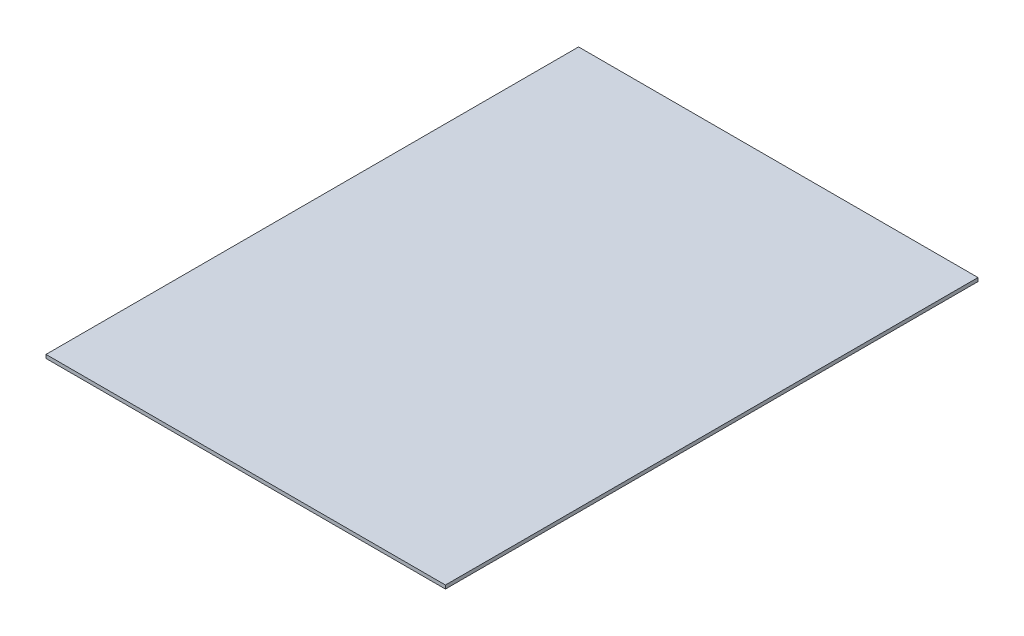
ISO-10303-21;
HEADER;
FILE_DESCRIPTION(('STEP AP214'),'2;1');
FILE_NAME('part.step','',(''),(''),'','','');
FILE_SCHEMA(('AUTOMOTIVE_DESIGN { 1 0 10303 214 1 1 1 1 }'));
ENDSEC;
DATA;
#1=APPLICATION_CONTEXT('core data for automotive mechanical design processes');
#2=APPLICATION_PROTOCOL_DEFINITION('international standard','automotive_design',2000,#1);
#3=PRODUCT_CONTEXT('',#1,'mechanical');
#4=PRODUCT('Part','Part','',(#3));
#5=PRODUCT_RELATED_PRODUCT_CATEGORY('part','',(#4));
#6=PRODUCT_DEFINITION_FORMATION('','',#4);
#7=PRODUCT_DEFINITION_CONTEXT('part definition',#1,'design');
#8=PRODUCT_DEFINITION('design','',#6,#7);
#9=PRODUCT_DEFINITION_SHAPE('','',#8);
#10=(LENGTH_UNIT() NAMED_UNIT(*) SI_UNIT(.MILLI.,.METRE.));
#11=(NAMED_UNIT(*) PLANE_ANGLE_UNIT() SI_UNIT($,.RADIAN.));
#12=(NAMED_UNIT(*) SI_UNIT($,.STERADIAN.) SOLID_ANGLE_UNIT());
#13=UNCERTAINTY_MEASURE_WITH_UNIT(LENGTH_MEASURE(1.E-05),#10,'distance_accuracy_value','');
#14=(GEOMETRIC_REPRESENTATION_CONTEXT(3) GLOBAL_UNCERTAINTY_ASSIGNED_CONTEXT((#13)) GLOBAL_UNIT_ASSIGNED_CONTEXT((#10,
#11,#12)) REPRESENTATION_CONTEXT('',''));
#15=CARTESIAN_POINT('',(0.,0.,0.));
#16=DIRECTION('',(0.,0.,1.));
#17=DIRECTION('',(1.,0.,0.));
#18=AXIS2_PLACEMENT_3D('',#15,#16,#17);
#19=CARTESIAN_POINT('',(-304.8,0.762,304.8));
#20=DIRECTION('',(0.,-1.,0.));
#21=DIRECTION('',(0.,0.,-1.));
#22=AXIS2_PLACEMENT_3D('',#19,#20,#21);
#23=PLANE('',#22);
#24=DIRECTION('',(-1.,0.,0.));
#25=VECTOR('',#24,1.);
#26=CARTESIAN_POINT('',(-304.8,0.762,76.2));
#27=LINE('',#26,#25);
#28=CARTESIAN_POINT('',(-133.35,0.762,76.2));
#29=VERTEX_POINT('',#28);
#30=CARTESIAN_POINT('',(-304.8,0.762,76.2));
#31=VERTEX_POINT('',#30);
#32=EDGE_CURVE('E94',#29,#31,#27,.T.);
#33=ORIENTED_EDGE('',*,*,#32,.T.);
#34=DIRECTION('',(0.,0.,-1.));
#35=VECTOR('',#34,1.);
#36=CARTESIAN_POINT('',(-304.8,0.762,304.8));
#37=LINE('',#36,#35);
#38=CARTESIAN_POINT('',(-304.8,0.762,304.8));
#39=VERTEX_POINT('',#38);
#40=EDGE_CURVE('E12',#39,#31,#37,.T.);
#41=ORIENTED_EDGE('',*,*,#40,.F.);
#42=DIRECTION('',(-1.,0.,0.));
#43=VECTOR('',#42,1.);
#44=CARTESIAN_POINT('',(-304.8,0.762,304.8));
#45=LINE('',#44,#43);
#46=CARTESIAN_POINT('',(-133.35,0.762,304.8));
#47=VERTEX_POINT('',#46);
#48=EDGE_CURVE('E118',#47,#39,#45,.T.);
#49=ORIENTED_EDGE('',*,*,#48,.F.);
#50=DIRECTION('',(0.,0.,-1.));
#51=VECTOR('',#50,1.);
#52=CARTESIAN_POINT('',(-133.35,0.762,304.8));
#53=LINE('',#52,#51);
#54=EDGE_CURVE('E61',#47,#29,#53,.T.);
#55=ORIENTED_EDGE('',*,*,#54,.T.);
#56=EDGE_LOOP('',(#33,#41,#49,#55));
#57=FACE_BOUND('',#56,.T.);
#58=ADVANCED_FACE('F46',(#57),#23,.F.);
#59=CARTESIAN_POINT('',(-304.8,-0.762,304.8));
#60=DIRECTION('',(1.,0.,0.));
#61=DIRECTION('',(0.,0.,-1.));
#62=AXIS2_PLACEMENT_3D('',#59,#60,#61);
#63=PLANE('',#62);
#64=DIRECTION('',(0.,1.,0.));
#65=VECTOR('',#64,1.);
#66=CARTESIAN_POINT('',(-304.8,-0.762,76.2));
#67=LINE('',#66,#65);
#68=CARTESIAN_POINT('',(-304.8,-0.762,76.2));
#69=VERTEX_POINT('',#68);
#70=EDGE_CURVE('E96',#69,#31,#67,.T.);
#71=ORIENTED_EDGE('',*,*,#70,.F.);
#72=DIRECTION('',(0.,0.,-1.));
#73=VECTOR('',#72,1.);
#74=CARTESIAN_POINT('',(-304.8,-0.762,304.8));
#75=LINE('',#74,#73);
#76=CARTESIAN_POINT('',(-304.8,-0.762,304.8));
#77=VERTEX_POINT('',#76);
#78=EDGE_CURVE('E54',#77,#69,#75,.T.);
#79=ORIENTED_EDGE('',*,*,#78,.F.);
#80=DIRECTION('',(0.,-1.,0.));
#81=VECTOR('',#80,1.);
#82=CARTESIAN_POINT('',(-304.8,-0.762,304.8));
#83=LINE('',#82,#81);
#84=EDGE_CURVE('E69',#39,#77,#83,.T.);
#85=ORIENTED_EDGE('',*,*,#84,.F.);
#86=ORIENTED_EDGE('',*,*,#40,.T.);
#87=EDGE_LOOP('',(#71,#79,#85,#86));
#88=FACE_BOUND('',#87,.T.);
#89=ADVANCED_FACE('F132',(#88),#63,.F.);
#90=CARTESIAN_POINT('',(-304.8,-0.762,304.8));
#91=DIRECTION('',(0.,1.,0.));
#92=DIRECTION('',(0.,0.,1.));
#93=AXIS2_PLACEMENT_3D('',#90,#91,#92);
#94=PLANE('',#93);
#95=DIRECTION('',(-1.,0.,0.));
#96=VECTOR('',#95,1.);
#97=CARTESIAN_POINT('',(-304.8,-0.762,76.2));
#98=LINE('',#97,#96);
#99=CARTESIAN_POINT('',(-133.35,-0.762,76.2));
#100=VERTEX_POINT('',#99);
#101=EDGE_CURVE('E91',#100,#69,#98,.T.);
#102=ORIENTED_EDGE('',*,*,#101,.F.);
#103=DIRECTION('',(0.,0.,-1.));
#104=VECTOR('',#103,1.);
#105=CARTESIAN_POINT('',(-133.35,-0.762,304.8));
#106=LINE('',#105,#104);
#107=CARTESIAN_POINT('',(-133.35,-0.762,304.8));
#108=VERTEX_POINT('',#107);
#109=EDGE_CURVE('E100',#108,#100,#106,.T.);
#110=ORIENTED_EDGE('',*,*,#109,.F.);
#111=DIRECTION('',(1.,0.,0.));
#112=VECTOR('',#111,1.);
#113=CARTESIAN_POINT('',(-304.8,-0.762,304.8));
#114=LINE('',#113,#112);
#115=EDGE_CURVE('E124',#77,#108,#114,.T.);
#116=ORIENTED_EDGE('',*,*,#115,.F.);
#117=ORIENTED_EDGE('',*,*,#78,.T.);
#118=EDGE_LOOP('',(#102,#110,#116,#117));
#119=FACE_BOUND('',#118,.T.);
#120=ADVANCED_FACE('F107',(#119),#94,.F.);
#121=CARTESIAN_POINT('',(0.,0.,304.8));
#122=DIRECTION('',(0.,0.,-1.));
#123=DIRECTION('',(-1.,0.,0.));
#124=AXIS2_PLACEMENT_3D('',#121,#122,#123);
#125=PLANE('',#124);
#126=DIRECTION('',(0.,1.,0.));
#127=VECTOR('',#126,1.);
#128=CARTESIAN_POINT('',(-133.35,-0.762,304.8));
#129=LINE('',#128,#127);
#130=EDGE_CURVE('E97',#108,#47,#129,.T.);
#131=ORIENTED_EDGE('',*,*,#130,.T.);
#132=ORIENTED_EDGE('',*,*,#48,.T.);
#133=ORIENTED_EDGE('',*,*,#84,.T.);
#134=ORIENTED_EDGE('',*,*,#115,.T.);
#135=EDGE_LOOP('',(#131,#132,#133,#134));
#136=FACE_BOUND('',#135,.T.);
#137=ADVANCED_FACE('F127',(#136),#125,.F.);
#138=CARTESIAN_POINT('',(-304.8,-0.762,76.2));
#139=DIRECTION('',(0.,0.,-1.));
#140=DIRECTION('',(-1.,0.,0.));
#141=AXIS2_PLACEMENT_3D('',#138,#139,#140);
#142=PLANE('',#141);
#143=ORIENTED_EDGE('',*,*,#32,.F.);
#144=DIRECTION('',(0.,1.,0.));
#145=VECTOR('',#144,1.);
#146=CARTESIAN_POINT('',(-133.35,-0.762,76.2));
#147=LINE('',#146,#145);
#148=EDGE_CURVE('E87',#100,#29,#147,.T.);
#149=ORIENTED_EDGE('',*,*,#148,.F.);
#150=ORIENTED_EDGE('',*,*,#101,.T.);
#151=ORIENTED_EDGE('',*,*,#70,.T.);
#152=EDGE_LOOP('',(#143,#149,#150,#151));
#153=FACE_BOUND('',#152,.T.);
#154=ADVANCED_FACE('F89',(#153),#142,.T.);
#155=CARTESIAN_POINT('',(-133.35,-0.762,304.8));
#156=DIRECTION('',(1.,0.,0.));
#157=DIRECTION('',(0.,0.,-1.));
#158=AXIS2_PLACEMENT_3D('',#155,#156,#157);
#159=PLANE('',#158);
#160=ORIENTED_EDGE('',*,*,#54,.F.);
#161=ORIENTED_EDGE('',*,*,#130,.F.);
#162=ORIENTED_EDGE('',*,*,#109,.T.);
#163=ORIENTED_EDGE('',*,*,#148,.T.);
#164=EDGE_LOOP('',(#160,#161,#162,#163));
#165=FACE_BOUND('',#164,.T.);
#166=ADVANCED_FACE('F101',(#165),#159,.T.);
#167=CLOSED_SHELL('',(#58,#89,#120,#137,#154,#166));
#168=MANIFOLD_SOLID_BREP('B2',#167);
#169=ADVANCED_BREP_SHAPE_REPRESENTATION('',(#18,#168),#14);
#170=SHAPE_DEFINITION_REPRESENTATION(#9,#169);
ENDSEC;
END-ISO-10303-21;
